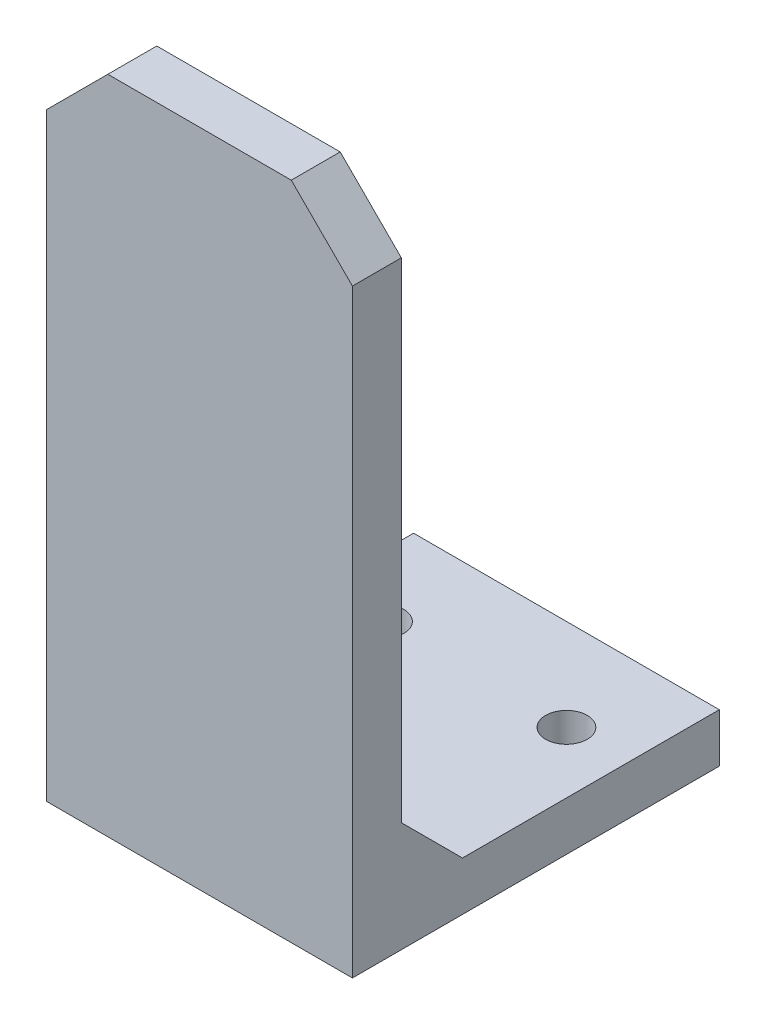
ISO-10303-21;
HEADER;
FILE_DESCRIPTION(('STEP AP214'),'2;1');
FILE_NAME('part.step','',(''),(''),'','','');
FILE_SCHEMA(('AUTOMOTIVE_DESIGN { 1 0 10303 214 1 1 1 1 }'));
ENDSEC;
DATA;
#1=APPLICATION_CONTEXT('core data for automotive mechanical design processes');
#2=APPLICATION_PROTOCOL_DEFINITION('international standard','automotive_design',2000,#1);
#3=PRODUCT_CONTEXT('',#1,'mechanical');
#4=PRODUCT('Part','Part','',(#3));
#5=PRODUCT_RELATED_PRODUCT_CATEGORY('part','',(#4));
#6=PRODUCT_DEFINITION_FORMATION('','',#4);
#7=PRODUCT_DEFINITION_CONTEXT('part definition',#1,'design');
#8=PRODUCT_DEFINITION('design','',#6,#7);
#9=PRODUCT_DEFINITION_SHAPE('','',#8);
#10=(LENGTH_UNIT() NAMED_UNIT(*) SI_UNIT(.MILLI.,.METRE.));
#11=(NAMED_UNIT(*) PLANE_ANGLE_UNIT() SI_UNIT($,.RADIAN.));
#12=(NAMED_UNIT(*) SI_UNIT($,.STERADIAN.) SOLID_ANGLE_UNIT());
#13=UNCERTAINTY_MEASURE_WITH_UNIT(LENGTH_MEASURE(1.E-05),#10,'distance_accuracy_value','');
#14=(GEOMETRIC_REPRESENTATION_CONTEXT(3) GLOBAL_UNCERTAINTY_ASSIGNED_CONTEXT((#13)) GLOBAL_UNIT_ASSIGNED_CONTEXT((#10,
#11,#12)) REPRESENTATION_CONTEXT('',''));
#15=CARTESIAN_POINT('',(0.,0.,0.));
#16=DIRECTION('',(0.,0.,1.));
#17=DIRECTION('',(1.,0.,0.));
#18=AXIS2_PLACEMENT_3D('',#15,#16,#17);
#19=CARTESIAN_POINT('',(0.,4.,0.));
#20=DIRECTION('',(0.,-1.,0.));
#21=DIRECTION('',(0.,0.,-1.));
#22=AXIS2_PLACEMENT_3D('',#19,#20,#21);
#23=PLANE('',#22);
#24=CARTESIAN_POINT('',(20.,4.,-22.5));
#25=DIRECTION('',(0.,1.,0.));
#26=DIRECTION('',(0.,0.,1.));
#27=AXIS2_PLACEMENT_3D('',#24,#25,#26);
#28=CIRCLE('',#27,1.7);
#29=CARTESIAN_POINT('',(20.,4.,-20.8));
#30=VERTEX_POINT('',#29);
#31=EDGE_CURVE('E241',#30,#30,#28,.T.);
#32=ORIENTED_EDGE('',*,*,#31,.F.);
#33=EDGE_LOOP('',(#32));
#34=FACE_BOUND('',#33,.T.);
#35=CARTESIAN_POINT('',(5.,4.,-22.5));
#36=DIRECTION('',(0.,1.,0.));
#37=DIRECTION('',(0.,0.,1.));
#38=AXIS2_PLACEMENT_3D('',#35,#36,#37);
#39=CIRCLE('',#38,1.7);
#40=CARTESIAN_POINT('',(5.,4.,-20.8));
#41=VERTEX_POINT('',#40);
#42=EDGE_CURVE('E161',#41,#41,#39,.T.);
#43=ORIENTED_EDGE('',*,*,#42,.F.);
#44=EDGE_LOOP('',(#43));
#45=FACE_BOUND('',#44,.T.);
#46=DIRECTION('',(0.,0.,1.));
#47=VECTOR('',#46,1.);
#48=CARTESIAN_POINT('',(0.,4.,0.));
#49=LINE('',#48,#47);
#50=CARTESIAN_POINT('',(0.,4.,-30.));
#51=VERTEX_POINT('',#50);
#52=CARTESIAN_POINT('',(0.,4.,-9.));
#53=VERTEX_POINT('',#52);
#54=EDGE_CURVE('E138',#51,#53,#49,.T.);
#55=ORIENTED_EDGE('',*,*,#54,.T.);
#56=DIRECTION('',(1.,0.,0.));
#57=VECTOR('',#56,1.);
#58=CARTESIAN_POINT('',(-7.07106781186548,4.,-9.));
#59=LINE('',#58,#57);
#60=CARTESIAN_POINT('',(25.,4.,-9.));
#61=VERTEX_POINT('',#60);
#62=EDGE_CURVE('E125',#53,#61,#59,.T.);
#63=ORIENTED_EDGE('',*,*,#62,.T.);
#64=DIRECTION('',(0.,0.,-1.));
#65=VECTOR('',#64,1.);
#66=CARTESIAN_POINT('',(25.,4.,0.));
#67=LINE('',#66,#65);
#68=CARTESIAN_POINT('',(25.,4.,-30.));
#69=VERTEX_POINT('',#68);
#70=EDGE_CURVE('E135',#61,#69,#67,.T.);
#71=ORIENTED_EDGE('',*,*,#70,.T.);
#72=DIRECTION('',(-1.,0.,0.));
#73=VECTOR('',#72,1.);
#74=CARTESIAN_POINT('',(0.,4.,-30.));
#75=LINE('',#74,#73);
#76=EDGE_CURVE('E146',#69,#51,#75,.T.);
#77=ORIENTED_EDGE('',*,*,#76,.T.);
#78=EDGE_LOOP('',(#55,#63,#71,#77));
#79=FACE_BOUND('',#78,.T.);
#80=ADVANCED_FACE('F47',(#34,#45,#79),#23,.F.);
#81=CARTESIAN_POINT('',(0.,0.,0.));
#82=DIRECTION('',(0.,-1.,0.));
#83=DIRECTION('',(0.,0.,-1.));
#84=AXIS2_PLACEMENT_3D('',#81,#82,#83);
#85=PLANE('',#84);
#86=CARTESIAN_POINT('',(5.,0.,-22.5));
#87=DIRECTION('',(0.,1.,0.));
#88=DIRECTION('',(0.,0.,1.));
#89=AXIS2_PLACEMENT_3D('',#86,#87,#88);
#90=CIRCLE('',#89,1.7);
#91=CARTESIAN_POINT('',(5.,0.,-20.8));
#92=VERTEX_POINT('',#91);
#93=EDGE_CURVE('E247',#92,#92,#90,.T.);
#94=ORIENTED_EDGE('',*,*,#93,.T.);
#95=EDGE_LOOP('',(#94));
#96=FACE_BOUND('',#95,.T.);
#97=DIRECTION('',(0.,0.,1.));
#98=VECTOR('',#97,1.);
#99=CARTESIAN_POINT('',(0.,0.,0.));
#100=LINE('',#99,#98);
#101=CARTESIAN_POINT('',(0.,0.,-30.));
#102=VERTEX_POINT('',#101);
#103=CARTESIAN_POINT('',(0.,0.,0.));
#104=VERTEX_POINT('',#103);
#105=EDGE_CURVE('E156',#102,#104,#100,.T.);
#106=ORIENTED_EDGE('',*,*,#105,.F.);
#107=DIRECTION('',(-1.,0.,0.));
#108=VECTOR('',#107,1.);
#109=CARTESIAN_POINT('',(0.,0.,-30.));
#110=LINE('',#109,#108);
#111=CARTESIAN_POINT('',(25.,0.,-30.));
#112=VERTEX_POINT('',#111);
#113=EDGE_CURVE('E152',#112,#102,#110,.T.);
#114=ORIENTED_EDGE('',*,*,#113,.F.);
#115=DIRECTION('',(0.,0.,-1.));
#116=VECTOR('',#115,1.);
#117=CARTESIAN_POINT('',(25.,0.,0.));
#118=LINE('',#117,#116);
#119=CARTESIAN_POINT('',(25.,0.,0.));
#120=VERTEX_POINT('',#119);
#121=EDGE_CURVE('E165',#120,#112,#118,.T.);
#122=ORIENTED_EDGE('',*,*,#121,.F.);
#123=DIRECTION('',(1.,0.,0.));
#124=VECTOR('',#123,1.);
#125=CARTESIAN_POINT('',(0.,0.,0.));
#126=LINE('',#125,#124);
#127=EDGE_CURVE('E160',#104,#120,#126,.T.);
#128=ORIENTED_EDGE('',*,*,#127,.F.);
#129=EDGE_LOOP('',(#106,#114,#122,#128));
#130=FACE_BOUND('',#129,.T.);
#131=CARTESIAN_POINT('',(20.,0.,-22.5));
#132=DIRECTION('',(0.,1.,0.));
#133=DIRECTION('',(0.,0.,1.));
#134=AXIS2_PLACEMENT_3D('',#131,#132,#133);
#135=CIRCLE('',#134,1.7);
#136=CARTESIAN_POINT('',(20.,0.,-20.8));
#137=VERTEX_POINT('',#136);
#138=EDGE_CURVE('E236',#137,#137,#135,.T.);
#139=ORIENTED_EDGE('',*,*,#138,.T.);
#140=EDGE_LOOP('',(#139));
#141=FACE_BOUND('',#140,.T.);
#142=ADVANCED_FACE('F227',(#96,#130,#141),#85,.T.);
#143=CARTESIAN_POINT('',(0.,4.,0.));
#144=DIRECTION('',(1.,0.,0.));
#145=DIRECTION('',(0.,0.,-1.));
#146=AXIS2_PLACEMENT_3D('',#143,#144,#145);
#147=PLANE('',#146);
#148=DIRECTION('',(0.,-1.,0.));
#149=VECTOR('',#148,1.);
#150=CARTESIAN_POINT('',(0.,4.,0.));
#151=LINE('',#150,#149);
#152=CARTESIAN_POINT('',(0.,49.,0.));
#153=VERTEX_POINT('',#152);
#154=EDGE_CURVE('E178',#153,#104,#151,.T.);
#155=ORIENTED_EDGE('',*,*,#154,.F.);
#156=DIRECTION('',(0.,0.,-1.));
#157=VECTOR('',#156,1.);
#158=CARTESIAN_POINT('',(0.,49.,0.));
#159=LINE('',#158,#157);
#160=CARTESIAN_POINT('',(0.,49.,-4.));
#161=VERTEX_POINT('',#160);
#162=EDGE_CURVE('E72',#153,#161,#159,.T.);
#163=ORIENTED_EDGE('',*,*,#162,.T.);
#164=DIRECTION('',(0.,-1.,0.));
#165=VECTOR('',#164,1.);
#166=CARTESIAN_POINT('',(0.,54.,-4.));
#167=LINE('',#166,#165);
#168=CARTESIAN_POINT('',(0.,9.,-4.));
#169=VERTEX_POINT('',#168);
#170=EDGE_CURVE('E207',#161,#169,#167,.T.);
#171=ORIENTED_EDGE('',*,*,#170,.T.);
#172=DIRECTION('',(0.,-0.707106781186548,-0.707106781186547));
#173=VECTOR('',#172,1.);
#174=CARTESIAN_POINT('',(0.,9.,-4.));
#175=LINE('',#174,#173);
#176=EDGE_CURVE('E414',#169,#53,#175,.T.);
#177=ORIENTED_EDGE('',*,*,#176,.T.);
#178=ORIENTED_EDGE('',*,*,#54,.F.);
#179=DIRECTION('',(0.,-1.,0.));
#180=VECTOR('',#179,1.);
#181=CARTESIAN_POINT('',(0.,4.,-30.));
#182=LINE('',#181,#180);
#183=EDGE_CURVE('E150',#51,#102,#182,.T.);
#184=ORIENTED_EDGE('',*,*,#183,.T.);
#185=ORIENTED_EDGE('',*,*,#105,.T.);
#186=EDGE_LOOP('',(#155,#163,#171,#177,#178,#184,#185));
#187=FACE_BOUND('',#186,.T.);
#188=ADVANCED_FACE('F222',(#187),#147,.F.);
#189=CARTESIAN_POINT('',(0.,4.,0.));
#190=DIRECTION('',(0.,0.,-1.));
#191=DIRECTION('',(-1.,0.,0.));
#192=AXIS2_PLACEMENT_3D('',#189,#190,#191);
#193=PLANE('',#192);
#194=DIRECTION('',(1.,0.,0.));
#195=VECTOR('',#194,1.);
#196=CARTESIAN_POINT('',(0.,54.,0.));
#197=LINE('',#196,#195);
#198=CARTESIAN_POINT('',(5.,54.,0.));
#199=VERTEX_POINT('',#198);
#200=CARTESIAN_POINT('',(20.,54.,0.));
#201=VERTEX_POINT('',#200);
#202=EDGE_CURVE('E216',#199,#201,#197,.T.);
#203=ORIENTED_EDGE('',*,*,#202,.F.);
#204=DIRECTION('',(0.707106781186547,0.707106781186549,0.));
#205=VECTOR('',#204,1.);
#206=CARTESIAN_POINT('',(5.,54.,0.));
#207=LINE('',#206,#205);
#208=EDGE_CURVE('E196',#199,#153,#207,.F.);
#209=ORIENTED_EDGE('',*,*,#208,.T.);
#210=ORIENTED_EDGE('',*,*,#154,.T.);
#211=ORIENTED_EDGE('',*,*,#127,.T.);
#212=DIRECTION('',(0.,-1.,0.));
#213=VECTOR('',#212,1.);
#214=CARTESIAN_POINT('',(25.,4.,0.));
#215=LINE('',#214,#213);
#216=CARTESIAN_POINT('',(25.,49.,0.));
#217=VERTEX_POINT('',#216);
#218=EDGE_CURVE('E175',#217,#120,#215,.T.);
#219=ORIENTED_EDGE('',*,*,#218,.F.);
#220=DIRECTION('',(0.707106781186547,-0.707106781186549,0.));
#221=VECTOR('',#220,1.);
#222=CARTESIAN_POINT('',(20.,54.,0.));
#223=LINE('',#222,#221);
#224=EDGE_CURVE('E193',#217,#201,#223,.F.);
#225=ORIENTED_EDGE('',*,*,#224,.T.);
#226=EDGE_LOOP('',(#203,#209,#210,#211,#219,#225));
#227=FACE_BOUND('',#226,.T.);
#228=ADVANCED_FACE('F220',(#227),#193,.F.);
#229=CARTESIAN_POINT('',(25.,4.,0.));
#230=DIRECTION('',(-1.,0.,0.));
#231=DIRECTION('',(0.,0.,1.));
#232=AXIS2_PLACEMENT_3D('',#229,#230,#231);
#233=PLANE('',#232);
#234=DIRECTION('',(0.,-1.,0.));
#235=VECTOR('',#234,1.);
#236=CARTESIAN_POINT('',(25.,54.,-4.));
#237=LINE('',#236,#235);
#238=CARTESIAN_POINT('',(25.,49.,-4.));
#239=VERTEX_POINT('',#238);
#240=CARTESIAN_POINT('',(25.,9.,-4.));
#241=VERTEX_POINT('',#240);
#242=EDGE_CURVE('E234',#239,#241,#237,.T.);
#243=ORIENTED_EDGE('',*,*,#242,.F.);
#244=DIRECTION('',(0.,0.,1.));
#245=VECTOR('',#244,1.);
#246=CARTESIAN_POINT('',(25.,49.,0.));
#247=LINE('',#246,#245);
#248=EDGE_CURVE('E11',#239,#217,#247,.T.);
#249=ORIENTED_EDGE('',*,*,#248,.T.);
#250=ORIENTED_EDGE('',*,*,#218,.T.);
#251=ORIENTED_EDGE('',*,*,#121,.T.);
#252=DIRECTION('',(0.,-1.,0.));
#253=VECTOR('',#252,1.);
#254=CARTESIAN_POINT('',(25.,4.,-30.));
#255=LINE('',#254,#253);
#256=EDGE_CURVE('E143',#69,#112,#255,.T.);
#257=ORIENTED_EDGE('',*,*,#256,.F.);
#258=ORIENTED_EDGE('',*,*,#70,.F.);
#259=DIRECTION('',(0.,0.707106781186548,0.707106781186547));
#260=VECTOR('',#259,1.);
#261=CARTESIAN_POINT('',(25.,9.,-4.));
#262=LINE('',#261,#260);
#263=EDGE_CURVE('E121',#61,#241,#262,.T.);
#264=ORIENTED_EDGE('',*,*,#263,.T.);
#265=EDGE_LOOP('',(#243,#249,#250,#251,#257,#258,#264));
#266=FACE_BOUND('',#265,.T.);
#267=ADVANCED_FACE('F141',(#266),#233,.F.);
#268=CARTESIAN_POINT('',(0.,4.,-30.));
#269=DIRECTION('',(0.,0.,1.));
#270=DIRECTION('',(1.,0.,0.));
#271=AXIS2_PLACEMENT_3D('',#268,#269,#270);
#272=PLANE('',#271);
#273=ORIENTED_EDGE('',*,*,#113,.T.);
#274=ORIENTED_EDGE('',*,*,#183,.F.);
#275=ORIENTED_EDGE('',*,*,#76,.F.);
#276=ORIENTED_EDGE('',*,*,#256,.T.);
#277=EDGE_LOOP('',(#273,#274,#275,#276));
#278=FACE_BOUND('',#277,.T.);
#279=ADVANCED_FACE('F259',(#278),#272,.F.);
#280=CARTESIAN_POINT('',(5.,4.,-22.5));
#281=DIRECTION('',(0.,-1.,0.));
#282=DIRECTION('',(0.,0.,-1.));
#283=AXIS2_PLACEMENT_3D('',#280,#281,#282);
#284=CYLINDRICAL_SURFACE('',#283,1.7);
#285=ORIENTED_EDGE('',*,*,#42,.T.);
#286=EDGE_LOOP('',(#285));
#287=FACE_BOUND('',#286,.T.);
#288=ORIENTED_EDGE('',*,*,#93,.F.);
#289=EDGE_LOOP('',(#288));
#290=FACE_BOUND('',#289,.T.);
#291=ADVANCED_FACE('F256',(#287,#290),#284,.F.);
#292=CARTESIAN_POINT('',(20.,4.,-22.5));
#293=DIRECTION('',(0.,-1.,0.));
#294=DIRECTION('',(0.,0.,-1.));
#295=AXIS2_PLACEMENT_3D('',#292,#293,#294);
#296=CYLINDRICAL_SURFACE('',#295,1.7);
#297=ORIENTED_EDGE('',*,*,#31,.T.);
#298=EDGE_LOOP('',(#297));
#299=FACE_BOUND('',#298,.T.);
#300=ORIENTED_EDGE('',*,*,#138,.F.);
#301=EDGE_LOOP('',(#300));
#302=FACE_BOUND('',#301,.T.);
#303=ADVANCED_FACE('F258',(#299,#302),#296,.F.);
#304=CARTESIAN_POINT('',(0.,54.,-4.));
#305=DIRECTION('',(0.,0.,1.));
#306=DIRECTION('',(1.,0.,0.));
#307=AXIS2_PLACEMENT_3D('',#304,#305,#306);
#308=PLANE('',#307);
#309=CARTESIAN_POINT('',(12.5,39.,-4.));
#310=DIRECTION('',(0.,0.,1.));
#311=DIRECTION('',(1.,0.,0.));
#312=AXIS2_PLACEMENT_3D('',#309,#310,#311);
#313=CIRCLE('',#312,2.9);
#314=CARTESIAN_POINT('',(15.4,39.,-4.));
#315=VERTEX_POINT('',#314);
#316=EDGE_CURVE('E181',#315,#315,#313,.F.);
#317=ORIENTED_EDGE('',*,*,#316,.F.);
#318=EDGE_LOOP('',(#317));
#319=FACE_BOUND('',#318,.T.);
#320=ORIENTED_EDGE('',*,*,#170,.F.);
#321=DIRECTION('',(-0.707106781186547,-0.707106781186549,0.));
#322=VECTOR('',#321,1.);
#323=CARTESIAN_POINT('',(5.,54.,-4.));
#324=LINE('',#323,#322);
#325=CARTESIAN_POINT('',(5.,54.,-4.));
#326=VERTEX_POINT('',#325);
#327=EDGE_CURVE('E57',#161,#326,#324,.F.);
#328=ORIENTED_EDGE('',*,*,#327,.T.);
#329=DIRECTION('',(-1.,0.,0.));
#330=VECTOR('',#329,1.);
#331=CARTESIAN_POINT('',(0.,54.,-4.));
#332=LINE('',#331,#330);
#333=CARTESIAN_POINT('',(20.,54.,-4.));
#334=VERTEX_POINT('',#333);
#335=EDGE_CURVE('E206',#334,#326,#332,.T.);
#336=ORIENTED_EDGE('',*,*,#335,.F.);
#337=DIRECTION('',(-0.707106781186547,0.707106781186549,0.));
#338=VECTOR('',#337,1.);
#339=CARTESIAN_POINT('',(20.,54.,-4.));
#340=LINE('',#339,#338);
#341=EDGE_CURVE('E64',#334,#239,#340,.F.);
#342=ORIENTED_EDGE('',*,*,#341,.T.);
#343=ORIENTED_EDGE('',*,*,#242,.T.);
#344=DIRECTION('',(1.,0.,0.));
#345=VECTOR('',#344,1.);
#346=CARTESIAN_POINT('',(-7.07106781186548,9.,-4.));
#347=LINE('',#346,#345);
#348=EDGE_CURVE('E128',#169,#241,#347,.T.);
#349=ORIENTED_EDGE('',*,*,#348,.F.);
#350=EDGE_LOOP('',(#320,#328,#336,#342,#343,#349));
#351=FACE_BOUND('',#350,.T.);
#352=ADVANCED_FACE('F205',(#319,#351),#308,.F.);
#353=CARTESIAN_POINT('',(0.,54.,0.));
#354=DIRECTION('',(0.,-1.,0.));
#355=DIRECTION('',(0.,0.,-1.));
#356=AXIS2_PLACEMENT_3D('',#353,#354,#355);
#357=PLANE('',#356);
#358=ORIENTED_EDGE('',*,*,#335,.T.);
#359=DIRECTION('',(0.,0.,1.));
#360=VECTOR('',#359,1.);
#361=CARTESIAN_POINT('',(5.,54.,0.));
#362=LINE('',#361,#360);
#363=EDGE_CURVE('E189',#326,#199,#362,.T.);
#364=ORIENTED_EDGE('',*,*,#363,.T.);
#365=ORIENTED_EDGE('',*,*,#202,.T.);
#366=DIRECTION('',(0.,0.,-1.));
#367=VECTOR('',#366,1.);
#368=CARTESIAN_POINT('',(20.,54.,0.));
#369=LINE('',#368,#367);
#370=EDGE_CURVE('E185',#201,#334,#369,.T.);
#371=ORIENTED_EDGE('',*,*,#370,.T.);
#372=EDGE_LOOP('',(#358,#364,#365,#371));
#373=FACE_BOUND('',#372,.T.);
#374=ADVANCED_FACE('F211',(#373),#357,.F.);
#375=CARTESIAN_POINT('',(-7.07106781186548,9.,-4.));
#376=DIRECTION('',(0.,0.707106781186547,-0.707106781186548));
#377=DIRECTION('',(0.,0.707106781186548,0.707106781186547));
#378=AXIS2_PLACEMENT_3D('',#375,#376,#377);
#379=PLANE('',#378);
#380=ORIENTED_EDGE('',*,*,#176,.F.);
#381=ORIENTED_EDGE('',*,*,#348,.T.);
#382=ORIENTED_EDGE('',*,*,#263,.F.);
#383=ORIENTED_EDGE('',*,*,#62,.F.);
#384=EDGE_LOOP('',(#380,#381,#382,#383));
#385=FACE_BOUND('',#384,.T.);
#386=ADVANCED_FACE('F124',(#385),#379,.T.);
#387=CARTESIAN_POINT('',(12.5,39.,-9.));
#388=DIRECTION('',(0.,0.,1.));
#389=DIRECTION('',(1.,0.,0.));
#390=AXIS2_PLACEMENT_3D('',#387,#388,#389);
#391=CYLINDRICAL_SURFACE('',#390,2.9);
#392=CARTESIAN_POINT('',(12.5,39.,-9.));
#393=DIRECTION('',(0.,0.,-1.));
#394=DIRECTION('',(-1.,0.,0.));
#395=AXIS2_PLACEMENT_3D('',#392,#393,#394);
#396=CIRCLE('',#395,2.9);
#397=CARTESIAN_POINT('',(9.6,39.,-9.));
#398=VERTEX_POINT('',#397);
#399=EDGE_CURVE('E132',#398,#398,#396,.T.);
#400=ORIENTED_EDGE('',*,*,#399,.F.);
#401=EDGE_LOOP('',(#400));
#402=FACE_BOUND('',#401,.T.);
#403=ORIENTED_EDGE('',*,*,#316,.T.);
#404=EDGE_LOOP('',(#403));
#405=FACE_BOUND('',#404,.T.);
#406=ADVANCED_FACE('F296',(#402,#405),#391,.T.);
#407=CARTESIAN_POINT('',(12.5,39.,-9.));
#408=DIRECTION('',(0.,0.,-1.));
#409=DIRECTION('',(-1.,0.,0.));
#410=AXIS2_PLACEMENT_3D('',#407,#408,#409);
#411=PLANE('',#410);
#412=ORIENTED_EDGE('',*,*,#399,.T.);
#413=EDGE_LOOP('',(#412));
#414=FACE_BOUND('',#413,.T.);
#415=ADVANCED_FACE('F290',(#414),#411,.T.);
#416=CARTESIAN_POINT('',(5.,54.,0.));
#417=DIRECTION('',(0.707106781186549,-0.707106781186547,0.));
#418=DIRECTION('',(0.,0.,1.));
#419=AXIS2_PLACEMENT_3D('',#416,#417,#418);
#420=PLANE('',#419);
#421=ORIENTED_EDGE('',*,*,#327,.F.);
#422=ORIENTED_EDGE('',*,*,#162,.F.);
#423=ORIENTED_EDGE('',*,*,#208,.F.);
#424=ORIENTED_EDGE('',*,*,#363,.F.);
#425=EDGE_LOOP('',(#421,#422,#423,#424));
#426=FACE_BOUND('',#425,.T.);
#427=ADVANCED_FACE('F218',(#426),#420,.F.);
#428=CARTESIAN_POINT('',(20.,54.,0.));
#429=DIRECTION('',(-0.707106781186549,-0.707106781186547,0.));
#430=DIRECTION('',(0.,0.,-1.));
#431=AXIS2_PLACEMENT_3D('',#428,#429,#430);
#432=PLANE('',#431);
#433=ORIENTED_EDGE('',*,*,#224,.F.);
#434=ORIENTED_EDGE('',*,*,#248,.F.);
#435=ORIENTED_EDGE('',*,*,#341,.F.);
#436=ORIENTED_EDGE('',*,*,#370,.F.);
#437=EDGE_LOOP('',(#433,#434,#435,#436));
#438=FACE_BOUND('',#437,.T.);
#439=ADVANCED_FACE('F50',(#438),#432,.F.);
#440=CLOSED_SHELL('',(#80,#142,#188,#228,#267,#279,#291,#303,#352,#374,#386,#406,#415,#427,#439));
#441=MANIFOLD_SOLID_BREP('B2',#440);
#442=ADVANCED_BREP_SHAPE_REPRESENTATION('',(#18,#441),#14);
#443=SHAPE_DEFINITION_REPRESENTATION(#9,#442);
ENDSEC;
END-ISO-10303-21;
